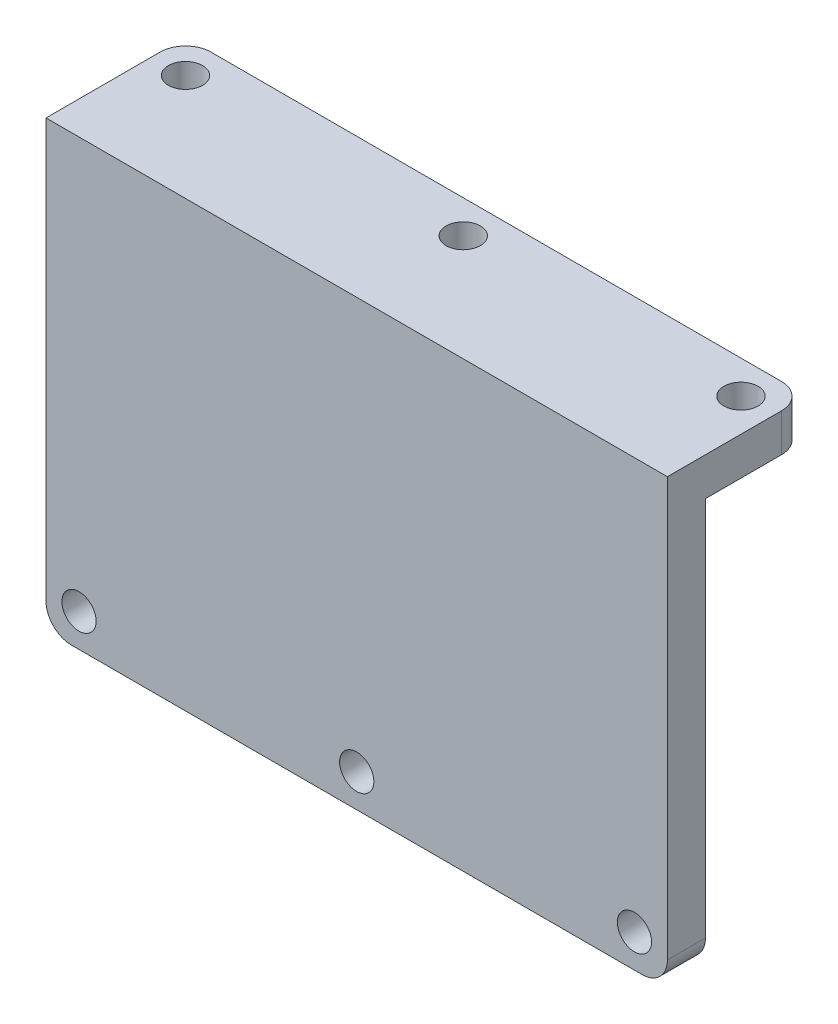
ISO-10303-21;
HEADER;
FILE_DESCRIPTION(('STEP AP214'),'2;1');
FILE_NAME('part.step','',(''),(''),'','','');
FILE_SCHEMA(('AUTOMOTIVE_DESIGN { 1 0 10303 214 1 1 1 1 }'));
ENDSEC;
DATA;
#1=APPLICATION_CONTEXT('core data for automotive mechanical design processes');
#2=APPLICATION_PROTOCOL_DEFINITION('international standard','automotive_design',2000,#1);
#3=PRODUCT_CONTEXT('',#1,'mechanical');
#4=PRODUCT('Part','Part','',(#3));
#5=PRODUCT_RELATED_PRODUCT_CATEGORY('part','',(#4));
#6=PRODUCT_DEFINITION_FORMATION('','',#4);
#7=PRODUCT_DEFINITION_CONTEXT('part definition',#1,'design');
#8=PRODUCT_DEFINITION('design','',#6,#7);
#9=PRODUCT_DEFINITION_SHAPE('','',#8);
#10=(LENGTH_UNIT() NAMED_UNIT(*) SI_UNIT(.MILLI.,.METRE.));
#11=(NAMED_UNIT(*) PLANE_ANGLE_UNIT() SI_UNIT($,.RADIAN.));
#12=(NAMED_UNIT(*) SI_UNIT($,.STERADIAN.) SOLID_ANGLE_UNIT());
#13=UNCERTAINTY_MEASURE_WITH_UNIT(LENGTH_MEASURE(1.E-05),#10,'distance_accuracy_value','');
#14=(GEOMETRIC_REPRESENTATION_CONTEXT(3) GLOBAL_UNCERTAINTY_ASSIGNED_CONTEXT((#13)) GLOBAL_UNIT_ASSIGNED_CONTEXT((#10,
#11,#12)) REPRESENTATION_CONTEXT('',''));
#15=CARTESIAN_POINT('',(0.,0.,0.));
#16=DIRECTION('',(0.,0.,1.));
#17=DIRECTION('',(1.,0.,0.));
#18=AXIS2_PLACEMENT_3D('',#15,#16,#17);
#19=CARTESIAN_POINT('',(0.,0.,0.));
#20=DIRECTION('',(0.,0.,1.));
#21=DIRECTION('',(1.,0.,0.));
#22=AXIS2_PLACEMENT_3D('',#19,#20,#21);
#23=PLANE('',#22);
#24=CARTESIAN_POINT('',(-21.9,-14.9,0.));
#25=DIRECTION('',(0.,0.,-1.));
#26=DIRECTION('',(-1.,0.,0.));
#27=AXIS2_PLACEMENT_3D('',#24,#25,#26);
#28=CIRCLE('',#27,1.35000000000001);
#29=CARTESIAN_POINT('',(-23.25,-14.9,0.));
#30=VERTEX_POINT('',#29);
#31=EDGE_CURVE('E152',#30,#30,#28,.T.);
#32=ORIENTED_EDGE('',*,*,#31,.F.);
#33=EDGE_LOOP('',(#32));
#34=FACE_BOUND('',#33,.T.);
#35=CARTESIAN_POINT('',(0.,-14.9,0.));
#36=DIRECTION('',(0.,0.,-1.));
#37=DIRECTION('',(-1.,0.,0.));
#38=AXIS2_PLACEMENT_3D('',#35,#36,#37);
#39=CIRCLE('',#38,1.35);
#40=CARTESIAN_POINT('',(-1.35,-14.9,0.));
#41=VERTEX_POINT('',#40);
#42=EDGE_CURVE('E165',#41,#41,#39,.T.);
#43=ORIENTED_EDGE('',*,*,#42,.F.);
#44=EDGE_LOOP('',(#43));
#45=FACE_BOUND('',#44,.T.);
#46=CARTESIAN_POINT('',(21.9,-14.9,0.));
#47=DIRECTION('',(0.,0.,-1.));
#48=DIRECTION('',(-1.,0.,0.));
#49=AXIS2_PLACEMENT_3D('',#46,#47,#48);
#50=CIRCLE('',#49,1.35000000000001);
#51=CARTESIAN_POINT('',(20.55,-14.9,0.));
#52=VERTEX_POINT('',#51);
#53=EDGE_CURVE('E157',#52,#52,#50,.T.);
#54=ORIENTED_EDGE('',*,*,#53,.F.);
#55=EDGE_LOOP('',(#54));
#56=FACE_BOUND('',#55,.T.);
#57=DIRECTION('',(0.,1.,0.));
#58=VECTOR('',#57,1.);
#59=CARTESIAN_POINT('',(24.5,17.5,0.));
#60=LINE('',#59,#58);
#61=CARTESIAN_POINT('',(24.5,-15.5,0.));
#62=VERTEX_POINT('',#61);
#63=CARTESIAN_POINT('',(24.5,14.5,0.));
#64=VERTEX_POINT('',#63);
#65=EDGE_CURVE('E133',#62,#64,#60,.T.);
#66=ORIENTED_EDGE('',*,*,#65,.F.);
#67=CARTESIAN_POINT('',(22.5,-15.5,0.));
#68=DIRECTION('',(0.,0.,1.));
#69=DIRECTION('',(1.,0.,0.));
#70=AXIS2_PLACEMENT_3D('',#67,#68,#69);
#71=CIRCLE('',#70,2.);
#72=CARTESIAN_POINT('',(22.5,-17.5,0.));
#73=VERTEX_POINT('',#72);
#74=EDGE_CURVE('E216',#62,#73,#71,.F.);
#75=ORIENTED_EDGE('',*,*,#74,.T.);
#76=DIRECTION('',(1.,0.,0.));
#77=VECTOR('',#76,1.);
#78=CARTESIAN_POINT('',(-24.5,-17.5,0.));
#79=LINE('',#78,#77);
#80=CARTESIAN_POINT('',(-22.5,-17.5,0.));
#81=VERTEX_POINT('',#80);
#82=EDGE_CURVE('E132',#81,#73,#79,.T.);
#83=ORIENTED_EDGE('',*,*,#82,.F.);
#84=CARTESIAN_POINT('',(-22.5,-15.5,0.));
#85=DIRECTION('',(0.,0.,1.));
#86=DIRECTION('',(1.,0.,0.));
#87=AXIS2_PLACEMENT_3D('',#84,#85,#86);
#88=CIRCLE('',#87,2.);
#89=CARTESIAN_POINT('',(-24.5,-15.5,0.));
#90=VERTEX_POINT('',#89);
#91=EDGE_CURVE('E130',#81,#90,#88,.F.);
#92=ORIENTED_EDGE('',*,*,#91,.T.);
#93=DIRECTION('',(0.,-1.,0.));
#94=VECTOR('',#93,1.);
#95=CARTESIAN_POINT('',(-24.5,17.5,0.));
#96=LINE('',#95,#94);
#97=CARTESIAN_POINT('',(-24.5,14.5,0.));
#98=VERTEX_POINT('',#97);
#99=EDGE_CURVE('E117',#98,#90,#96,.T.);
#100=ORIENTED_EDGE('',*,*,#99,.F.);
#101=DIRECTION('',(-1.,0.,0.));
#102=VECTOR('',#101,1.);
#103=CARTESIAN_POINT('',(24.5,14.5,0.));
#104=LINE('',#103,#102);
#105=EDGE_CURVE('E128',#64,#98,#104,.T.);
#106=ORIENTED_EDGE('',*,*,#105,.F.);
#107=EDGE_LOOP('',(#66,#75,#83,#92,#100,#106));
#108=FACE_BOUND('',#107,.T.);
#109=ADVANCED_FACE('F38',(#34,#45,#56,#108),#23,.F.);
#110=CARTESIAN_POINT('',(24.5,17.5,3.));
#111=DIRECTION('',(-1.,0.,0.));
#112=DIRECTION('',(0.,0.,1.));
#113=AXIS2_PLACEMENT_3D('',#110,#111,#112);
#114=PLANE('',#113);
#115=DIRECTION('',(0.,0.,1.));
#116=VECTOR('',#115,1.);
#117=CARTESIAN_POINT('',(24.5,14.5,-8.));
#118=LINE('',#117,#116);
#119=CARTESIAN_POINT('',(24.5,14.5,-6.));
#120=VERTEX_POINT('',#119);
#121=EDGE_CURVE('E122',#120,#64,#118,.T.);
#122=ORIENTED_EDGE('',*,*,#121,.F.);
#123=DIRECTION('',(0.,-1.,0.));
#124=VECTOR('',#123,1.);
#125=CARTESIAN_POINT('',(24.5,17.5,-6.));
#126=LINE('',#125,#124);
#127=CARTESIAN_POINT('',(24.5,17.5,-6.));
#128=VERTEX_POINT('',#127);
#129=EDGE_CURVE('E11',#120,#128,#126,.F.);
#130=ORIENTED_EDGE('',*,*,#129,.T.);
#131=DIRECTION('',(0.,0.,-1.));
#132=VECTOR('',#131,1.);
#133=CARTESIAN_POINT('',(24.5,17.5,3.));
#134=LINE('',#133,#132);
#135=CARTESIAN_POINT('',(24.5,17.5,3.));
#136=VERTEX_POINT('',#135);
#137=EDGE_CURVE('E198',#136,#128,#134,.T.);
#138=ORIENTED_EDGE('',*,*,#137,.F.);
#139=DIRECTION('',(0.,1.,0.));
#140=VECTOR('',#139,1.);
#141=CARTESIAN_POINT('',(24.5,17.5,3.));
#142=LINE('',#141,#140);
#143=CARTESIAN_POINT('',(24.5,-15.5,3.));
#144=VERTEX_POINT('',#143);
#145=EDGE_CURVE('E176',#144,#136,#142,.T.);
#146=ORIENTED_EDGE('',*,*,#145,.F.);
#147=DIRECTION('',(0.,0.,-1.));
#148=VECTOR('',#147,1.);
#149=CARTESIAN_POINT('',(24.5,-15.5,3.));
#150=LINE('',#149,#148);
#151=EDGE_CURVE('E202',#144,#62,#150,.T.);
#152=ORIENTED_EDGE('',*,*,#151,.T.);
#153=ORIENTED_EDGE('',*,*,#65,.T.);
#154=EDGE_LOOP('',(#122,#130,#138,#146,#152,#153));
#155=FACE_BOUND('',#154,.T.);
#156=ADVANCED_FACE('F282',(#155),#114,.F.);
#157=CARTESIAN_POINT('',(-24.5,17.5,3.));
#158=DIRECTION('',(0.,-1.,0.));
#159=DIRECTION('',(0.,0.,-1.));
#160=AXIS2_PLACEMENT_3D('',#157,#158,#159);
#161=PLANE('',#160);
#162=CARTESIAN_POINT('',(-21.9,17.5,-5.4));
#163=DIRECTION('',(0.,1.,0.));
#164=DIRECTION('',(0.,0.,1.));
#165=AXIS2_PLACEMENT_3D('',#162,#163,#164);
#166=CIRCLE('',#165,1.35000000000001);
#167=CARTESIAN_POINT('',(-21.9,17.5,-4.05));
#168=VERTEX_POINT('',#167);
#169=EDGE_CURVE('E207',#168,#168,#166,.T.);
#170=ORIENTED_EDGE('',*,*,#169,.F.);
#171=EDGE_LOOP('',(#170));
#172=FACE_BOUND('',#171,.T.);
#173=CARTESIAN_POINT('',(0.,17.5,-5.4));
#174=DIRECTION('',(0.,1.,0.));
#175=DIRECTION('',(0.,0.,1.));
#176=AXIS2_PLACEMENT_3D('',#173,#174,#175);
#177=CIRCLE('',#176,1.35);
#178=CARTESIAN_POINT('',(0.,17.5,-4.05));
#179=VERTEX_POINT('',#178);
#180=EDGE_CURVE('E478',#179,#179,#177,.T.);
#181=ORIENTED_EDGE('',*,*,#180,.F.);
#182=EDGE_LOOP('',(#181));
#183=FACE_BOUND('',#182,.T.);
#184=CARTESIAN_POINT('',(21.9,17.5,-5.4));
#185=DIRECTION('',(0.,1.,0.));
#186=DIRECTION('',(0.,0.,1.));
#187=AXIS2_PLACEMENT_3D('',#184,#185,#186);
#188=CIRCLE('',#187,1.35);
#189=CARTESIAN_POINT('',(21.9,17.5,-4.05));
#190=VERTEX_POINT('',#189);
#191=EDGE_CURVE('E482',#190,#190,#188,.T.);
#192=ORIENTED_EDGE('',*,*,#191,.F.);
#193=EDGE_LOOP('',(#192));
#194=FACE_BOUND('',#193,.T.);
#195=DIRECTION('',(1.,0.,0.));
#196=VECTOR('',#195,1.);
#197=CARTESIAN_POINT('',(24.5,17.5,-8.));
#198=LINE('',#197,#196);
#199=CARTESIAN_POINT('',(-22.5,17.5,-8.));
#200=VERTEX_POINT('',#199);
#201=CARTESIAN_POINT('',(22.5,17.5,-8.));
#202=VERTEX_POINT('',#201);
#203=EDGE_CURVE('E123',#200,#202,#198,.T.);
#204=ORIENTED_EDGE('',*,*,#203,.F.);
#205=CARTESIAN_POINT('',(-22.5,17.5,-6.));
#206=DIRECTION('',(0.,-1.,0.));
#207=DIRECTION('',(0.,0.,-1.));
#208=AXIS2_PLACEMENT_3D('',#205,#206,#207);
#209=CIRCLE('',#208,2.);
#210=CARTESIAN_POINT('',(-24.5,17.5,-6.));
#211=VERTEX_POINT('',#210);
#212=EDGE_CURVE('E246',#200,#211,#209,.F.);
#213=ORIENTED_EDGE('',*,*,#212,.T.);
#214=DIRECTION('',(0.,0.,-1.));
#215=VECTOR('',#214,1.);
#216=CARTESIAN_POINT('',(-24.5,17.5,3.));
#217=LINE('',#216,#215);
#218=CARTESIAN_POINT('',(-24.5,17.5,3.));
#219=VERTEX_POINT('',#218);
#220=EDGE_CURVE('E190',#219,#211,#217,.T.);
#221=ORIENTED_EDGE('',*,*,#220,.F.);
#222=DIRECTION('',(-1.,0.,0.));
#223=VECTOR('',#222,1.);
#224=CARTESIAN_POINT('',(-24.5,17.5,3.));
#225=LINE('',#224,#223);
#226=EDGE_CURVE('E179',#136,#219,#225,.T.);
#227=ORIENTED_EDGE('',*,*,#226,.F.);
#228=ORIENTED_EDGE('',*,*,#137,.T.);
#229=CARTESIAN_POINT('',(22.5,17.5,-6.));
#230=DIRECTION('',(0.,-1.,0.));
#231=DIRECTION('',(0.,0.,-1.));
#232=AXIS2_PLACEMENT_3D('',#229,#230,#231);
#233=CIRCLE('',#232,2.);
#234=EDGE_CURVE('E243',#128,#202,#233,.F.);
#235=ORIENTED_EDGE('',*,*,#234,.T.);
#236=EDGE_LOOP('',(#204,#213,#221,#227,#228,#235));
#237=FACE_BOUND('',#236,.T.);
#238=ADVANCED_FACE('F263',(#172,#183,#194,#237),#161,.F.);
#239=CARTESIAN_POINT('',(-24.5,17.5,3.));
#240=DIRECTION('',(1.,0.,0.));
#241=DIRECTION('',(0.,0.,-1.));
#242=AXIS2_PLACEMENT_3D('',#239,#240,#241);
#243=PLANE('',#242);
#244=ORIENTED_EDGE('',*,*,#220,.T.);
#245=DIRECTION('',(0.,1.,0.));
#246=VECTOR('',#245,1.);
#247=CARTESIAN_POINT('',(-24.5,14.5,-6.));
#248=LINE('',#247,#246);
#249=CARTESIAN_POINT('',(-24.5,14.5,-6.));
#250=VERTEX_POINT('',#249);
#251=EDGE_CURVE('E62',#211,#250,#248,.F.);
#252=ORIENTED_EDGE('',*,*,#251,.T.);
#253=DIRECTION('',(0.,0.,1.));
#254=VECTOR('',#253,1.);
#255=CARTESIAN_POINT('',(-24.5,14.5,-8.));
#256=LINE('',#255,#254);
#257=EDGE_CURVE('E114',#250,#98,#256,.T.);
#258=ORIENTED_EDGE('',*,*,#257,.T.);
#259=ORIENTED_EDGE('',*,*,#99,.T.);
#260=DIRECTION('',(0.,0.,-1.));
#261=VECTOR('',#260,1.);
#262=CARTESIAN_POINT('',(-24.5,-15.5,3.));
#263=LINE('',#262,#261);
#264=CARTESIAN_POINT('',(-24.5,-15.5,3.));
#265=VERTEX_POINT('',#264);
#266=EDGE_CURVE('E232',#90,#265,#263,.F.);
#267=ORIENTED_EDGE('',*,*,#266,.T.);
#268=DIRECTION('',(0.,-1.,0.));
#269=VECTOR('',#268,1.);
#270=CARTESIAN_POINT('',(-24.5,17.5,3.));
#271=LINE('',#270,#269);
#272=EDGE_CURVE('E182',#219,#265,#271,.T.);
#273=ORIENTED_EDGE('',*,*,#272,.F.);
#274=EDGE_LOOP('',(#244,#252,#258,#259,#267,#273));
#275=FACE_BOUND('',#274,.T.);
#276=ADVANCED_FACE('F116',(#275),#243,.F.);
#277=CARTESIAN_POINT('',(-24.5,-17.5,3.));
#278=DIRECTION('',(0.,1.,0.));
#279=DIRECTION('',(0.,0.,1.));
#280=AXIS2_PLACEMENT_3D('',#277,#278,#279);
#281=PLANE('',#280);
#282=ORIENTED_EDGE('',*,*,#82,.T.);
#283=DIRECTION('',(0.,0.,-1.));
#284=VECTOR('',#283,1.);
#285=CARTESIAN_POINT('',(22.5,-17.5,3.));
#286=LINE('',#285,#284);
#287=CARTESIAN_POINT('',(22.5,-17.5,3.));
#288=VERTEX_POINT('',#287);
#289=EDGE_CURVE('E223',#73,#288,#286,.F.);
#290=ORIENTED_EDGE('',*,*,#289,.T.);
#291=DIRECTION('',(1.,0.,0.));
#292=VECTOR('',#291,1.);
#293=CARTESIAN_POINT('',(-24.5,-17.5,3.));
#294=LINE('',#293,#292);
#295=CARTESIAN_POINT('',(-22.5,-17.5,3.));
#296=VERTEX_POINT('',#295);
#297=EDGE_CURVE('E186',#296,#288,#294,.T.);
#298=ORIENTED_EDGE('',*,*,#297,.F.);
#299=DIRECTION('',(0.,0.,-1.));
#300=VECTOR('',#299,1.);
#301=CARTESIAN_POINT('',(-22.5,-17.5,3.));
#302=LINE('',#301,#300);
#303=EDGE_CURVE('E219',#296,#81,#302,.T.);
#304=ORIENTED_EDGE('',*,*,#303,.T.);
#305=EDGE_LOOP('',(#282,#290,#298,#304));
#306=FACE_BOUND('',#305,.T.);
#307=ADVANCED_FACE('F274',(#306),#281,.F.);
#308=CARTESIAN_POINT('',(0.,0.,3.));
#309=DIRECTION('',(0.,0.,1.));
#310=DIRECTION('',(1.,0.,0.));
#311=AXIS2_PLACEMENT_3D('',#308,#309,#310);
#312=PLANE('',#311);
#313=CARTESIAN_POINT('',(21.9,-14.9,3.));
#314=DIRECTION('',(0.,0.,-1.));
#315=DIRECTION('',(-1.,0.,0.));
#316=AXIS2_PLACEMENT_3D('',#313,#314,#315);
#317=CIRCLE('',#316,1.35000000000001);
#318=CARTESIAN_POINT('',(20.55,-14.9,3.));
#319=VERTEX_POINT('',#318);
#320=EDGE_CURVE('E153',#319,#319,#317,.T.);
#321=ORIENTED_EDGE('',*,*,#320,.T.);
#322=EDGE_LOOP('',(#321));
#323=FACE_BOUND('',#322,.T.);
#324=CARTESIAN_POINT('',(0.,-14.9,3.));
#325=DIRECTION('',(0.,0.,-1.));
#326=DIRECTION('',(-1.,0.,0.));
#327=AXIS2_PLACEMENT_3D('',#324,#325,#326);
#328=CIRCLE('',#327,1.35);
#329=CARTESIAN_POINT('',(-1.35,-14.9,3.));
#330=VERTEX_POINT('',#329);
#331=EDGE_CURVE('E161',#330,#330,#328,.T.);
#332=ORIENTED_EDGE('',*,*,#331,.T.);
#333=EDGE_LOOP('',(#332));
#334=FACE_BOUND('',#333,.T.);
#335=CARTESIAN_POINT('',(-21.9,-14.9,3.));
#336=DIRECTION('',(0.,0.,-1.));
#337=DIRECTION('',(-1.,0.,0.));
#338=AXIS2_PLACEMENT_3D('',#335,#336,#337);
#339=CIRCLE('',#338,1.35000000000001);
#340=CARTESIAN_POINT('',(-23.25,-14.9,3.));
#341=VERTEX_POINT('',#340);
#342=EDGE_CURVE('E169',#341,#341,#339,.T.);
#343=ORIENTED_EDGE('',*,*,#342,.T.);
#344=EDGE_LOOP('',(#343));
#345=FACE_BOUND('',#344,.T.);
#346=ORIENTED_EDGE('',*,*,#297,.T.);
#347=CARTESIAN_POINT('',(22.5,-15.5,3.));
#348=DIRECTION('',(0.,0.,1.));
#349=DIRECTION('',(1.,0.,0.));
#350=AXIS2_PLACEMENT_3D('',#347,#348,#349);
#351=CIRCLE('',#350,2.);
#352=EDGE_CURVE('E229',#288,#144,#351,.T.);
#353=ORIENTED_EDGE('',*,*,#352,.T.);
#354=ORIENTED_EDGE('',*,*,#145,.T.);
#355=ORIENTED_EDGE('',*,*,#226,.T.);
#356=ORIENTED_EDGE('',*,*,#272,.T.);
#357=CARTESIAN_POINT('',(-22.5,-15.5,3.));
#358=DIRECTION('',(0.,0.,1.));
#359=DIRECTION('',(1.,0.,0.));
#360=AXIS2_PLACEMENT_3D('',#357,#358,#359);
#361=CIRCLE('',#360,2.);
#362=EDGE_CURVE('E226',#265,#296,#361,.T.);
#363=ORIENTED_EDGE('',*,*,#362,.T.);
#364=EDGE_LOOP('',(#346,#353,#354,#355,#356,#363));
#365=FACE_BOUND('',#364,.T.);
#366=ADVANCED_FACE('F268',(#323,#334,#345,#365),#312,.T.);
#367=CARTESIAN_POINT('',(-21.9,-14.9,3.));
#368=DIRECTION('',(0.,0.,-1.));
#369=DIRECTION('',(-1.,0.,0.));
#370=AXIS2_PLACEMENT_3D('',#367,#368,#369);
#371=CYLINDRICAL_SURFACE('',#370,1.35000000000001);
#372=ORIENTED_EDGE('',*,*,#342,.F.);
#373=EDGE_LOOP('',(#372));
#374=FACE_BOUND('',#373,.T.);
#375=ORIENTED_EDGE('',*,*,#31,.T.);
#376=EDGE_LOOP('',(#375));
#377=FACE_BOUND('',#376,.T.);
#378=ADVANCED_FACE('F375',(#374,#377),#371,.F.);
#379=CARTESIAN_POINT('',(0.,-14.9,3.));
#380=DIRECTION('',(0.,0.,-1.));
#381=DIRECTION('',(-1.,0.,0.));
#382=AXIS2_PLACEMENT_3D('',#379,#380,#381);
#383=CYLINDRICAL_SURFACE('',#382,1.35);
#384=ORIENTED_EDGE('',*,*,#331,.F.);
#385=EDGE_LOOP('',(#384));
#386=FACE_BOUND('',#385,.T.);
#387=ORIENTED_EDGE('',*,*,#42,.T.);
#388=EDGE_LOOP('',(#387));
#389=FACE_BOUND('',#388,.T.);
#390=ADVANCED_FACE('F438',(#386,#389),#383,.F.);
#391=CARTESIAN_POINT('',(21.9,-14.9,3.));
#392=DIRECTION('',(0.,0.,-1.));
#393=DIRECTION('',(-1.,0.,0.));
#394=AXIS2_PLACEMENT_3D('',#391,#392,#393);
#395=CYLINDRICAL_SURFACE('',#394,1.35000000000001);
#396=ORIENTED_EDGE('',*,*,#320,.F.);
#397=EDGE_LOOP('',(#396));
#398=FACE_BOUND('',#397,.T.);
#399=ORIENTED_EDGE('',*,*,#53,.T.);
#400=EDGE_LOOP('',(#399));
#401=FACE_BOUND('',#400,.T.);
#402=ADVANCED_FACE('F343',(#398,#401),#395,.F.);
#403=CARTESIAN_POINT('',(24.5,14.5,-8.));
#404=DIRECTION('',(0.,1.,0.));
#405=DIRECTION('',(0.,0.,1.));
#406=AXIS2_PLACEMENT_3D('',#403,#404,#405);
#407=PLANE('',#406);
#408=CARTESIAN_POINT('',(-21.9,14.5,-5.4));
#409=DIRECTION('',(0.,1.,0.));
#410=DIRECTION('',(0.,0.,1.));
#411=AXIS2_PLACEMENT_3D('',#408,#409,#410);
#412=CIRCLE('',#411,1.35000000000001);
#413=CARTESIAN_POINT('',(-21.9,14.5,-4.05));
#414=VERTEX_POINT('',#413);
#415=EDGE_CURVE('E139',#414,#414,#412,.T.);
#416=ORIENTED_EDGE('',*,*,#415,.T.);
#417=EDGE_LOOP('',(#416));
#418=FACE_BOUND('',#417,.T.);
#419=CARTESIAN_POINT('',(0.,14.5,-5.4));
#420=DIRECTION('',(0.,1.,0.));
#421=DIRECTION('',(0.,0.,1.));
#422=AXIS2_PLACEMENT_3D('',#419,#420,#421);
#423=CIRCLE('',#422,1.35);
#424=CARTESIAN_POINT('',(0.,14.5,-4.05));
#425=VERTEX_POINT('',#424);
#426=EDGE_CURVE('E146',#425,#425,#423,.T.);
#427=ORIENTED_EDGE('',*,*,#426,.T.);
#428=EDGE_LOOP('',(#427));
#429=FACE_BOUND('',#428,.T.);
#430=CARTESIAN_POINT('',(21.9,14.5,-5.4));
#431=DIRECTION('',(0.,1.,0.));
#432=DIRECTION('',(0.,0.,1.));
#433=AXIS2_PLACEMENT_3D('',#430,#431,#432);
#434=CIRCLE('',#433,1.35);
#435=CARTESIAN_POINT('',(21.9,14.5,-4.05));
#436=VERTEX_POINT('',#435);
#437=EDGE_CURVE('E203',#436,#436,#434,.T.);
#438=ORIENTED_EDGE('',*,*,#437,.T.);
#439=EDGE_LOOP('',(#438));
#440=FACE_BOUND('',#439,.T.);
#441=ORIENTED_EDGE('',*,*,#257,.F.);
#442=CARTESIAN_POINT('',(-22.5,14.5,-6.));
#443=DIRECTION('',(0.,1.,0.));
#444=DIRECTION('',(0.,0.,1.));
#445=AXIS2_PLACEMENT_3D('',#442,#443,#444);
#446=CIRCLE('',#445,2.);
#447=CARTESIAN_POINT('',(-22.5,14.5,-8.));
#448=VERTEX_POINT('',#447);
#449=EDGE_CURVE('E47',#250,#448,#446,.F.);
#450=ORIENTED_EDGE('',*,*,#449,.T.);
#451=DIRECTION('',(-1.,0.,0.));
#452=VECTOR('',#451,1.);
#453=CARTESIAN_POINT('',(24.5,14.5,-8.));
#454=LINE('',#453,#452);
#455=CARTESIAN_POINT('',(22.5,14.5,-8.));
#456=VERTEX_POINT('',#455);
#457=EDGE_CURVE('E138',#456,#448,#454,.T.);
#458=ORIENTED_EDGE('',*,*,#457,.F.);
#459=CARTESIAN_POINT('',(22.5,14.5,-6.));
#460=DIRECTION('',(0.,1.,0.));
#461=DIRECTION('',(0.,0.,1.));
#462=AXIS2_PLACEMENT_3D('',#459,#460,#461);
#463=CIRCLE('',#462,2.);
#464=EDGE_CURVE('E54',#456,#120,#463,.F.);
#465=ORIENTED_EDGE('',*,*,#464,.T.);
#466=ORIENTED_EDGE('',*,*,#121,.T.);
#467=ORIENTED_EDGE('',*,*,#105,.T.);
#468=EDGE_LOOP('',(#441,#450,#458,#465,#466,#467));
#469=FACE_BOUND('',#468,.T.);
#470=ADVANCED_FACE('F135',(#418,#429,#440,#469),#407,.F.);
#471=CARTESIAN_POINT('',(0.,0.,-8.));
#472=DIRECTION('',(0.,0.,-1.));
#473=DIRECTION('',(-1.,0.,0.));
#474=AXIS2_PLACEMENT_3D('',#471,#472,#473);
#475=PLANE('',#474);
#476=ORIENTED_EDGE('',*,*,#457,.T.);
#477=DIRECTION('',(0.,1.,0.));
#478=VECTOR('',#477,1.);
#479=CARTESIAN_POINT('',(-22.5,17.5,-8.));
#480=LINE('',#479,#478);
#481=EDGE_CURVE('E239',#448,#200,#480,.T.);
#482=ORIENTED_EDGE('',*,*,#481,.T.);
#483=ORIENTED_EDGE('',*,*,#203,.T.);
#484=DIRECTION('',(0.,-1.,0.));
#485=VECTOR('',#484,1.);
#486=CARTESIAN_POINT('',(22.5,14.5,-8.));
#487=LINE('',#486,#485);
#488=EDGE_CURVE('E235',#202,#456,#487,.T.);
#489=ORIENTED_EDGE('',*,*,#488,.T.);
#490=EDGE_LOOP('',(#476,#482,#483,#489));
#491=FACE_BOUND('',#490,.T.);
#492=ADVANCED_FACE('F256',(#491),#475,.T.);
#493=CARTESIAN_POINT('',(21.9,-17.5,-5.4));
#494=DIRECTION('',(0.,1.,0.));
#495=DIRECTION('',(0.,0.,1.));
#496=AXIS2_PLACEMENT_3D('',#493,#494,#495);
#497=CYLINDRICAL_SURFACE('',#496,1.35);
#498=ORIENTED_EDGE('',*,*,#191,.T.);
#499=EDGE_LOOP('',(#498));
#500=FACE_BOUND('',#499,.T.);
#501=ORIENTED_EDGE('',*,*,#437,.F.);
#502=EDGE_LOOP('',(#501));
#503=FACE_BOUND('',#502,.T.);
#504=ADVANCED_FACE('F336',(#500,#503),#497,.F.);
#505=CARTESIAN_POINT('',(0.,-17.5,-5.4));
#506=DIRECTION('',(0.,1.,0.));
#507=DIRECTION('',(0.,0.,1.));
#508=AXIS2_PLACEMENT_3D('',#505,#506,#507);
#509=CYLINDRICAL_SURFACE('',#508,1.35);
#510=ORIENTED_EDGE('',*,*,#180,.T.);
#511=EDGE_LOOP('',(#510));
#512=FACE_BOUND('',#511,.T.);
#513=ORIENTED_EDGE('',*,*,#426,.F.);
#514=EDGE_LOOP('',(#513));
#515=FACE_BOUND('',#514,.T.);
#516=ADVANCED_FACE('F407',(#512,#515),#509,.F.);
#517=CARTESIAN_POINT('',(-21.9,-17.5,-5.4));
#518=DIRECTION('',(0.,1.,0.));
#519=DIRECTION('',(0.,0.,1.));
#520=AXIS2_PLACEMENT_3D('',#517,#518,#519);
#521=CYLINDRICAL_SURFACE('',#520,1.35000000000001);
#522=ORIENTED_EDGE('',*,*,#169,.T.);
#523=EDGE_LOOP('',(#522));
#524=FACE_BOUND('',#523,.T.);
#525=ORIENTED_EDGE('',*,*,#415,.F.);
#526=EDGE_LOOP('',(#525));
#527=FACE_BOUND('',#526,.T.);
#528=ADVANCED_FACE('F313',(#524,#527),#521,.F.);
#529=CARTESIAN_POINT('',(22.5,-15.5,3.));
#530=DIRECTION('',(0.,0.,-1.));
#531=DIRECTION('',(-1.,0.,0.));
#532=AXIS2_PLACEMENT_3D('',#529,#530,#531);
#533=CYLINDRICAL_SURFACE('',#532,2.);
#534=ORIENTED_EDGE('',*,*,#352,.F.);
#535=ORIENTED_EDGE('',*,*,#289,.F.);
#536=ORIENTED_EDGE('',*,*,#74,.F.);
#537=ORIENTED_EDGE('',*,*,#151,.F.);
#538=EDGE_LOOP('',(#534,#535,#536,#537));
#539=FACE_BOUND('',#538,.T.);
#540=ADVANCED_FACE('F279',(#539),#533,.T.);
#541=CARTESIAN_POINT('',(-22.5,-15.5,3.));
#542=DIRECTION('',(0.,0.,-1.));
#543=DIRECTION('',(-1.,0.,0.));
#544=AXIS2_PLACEMENT_3D('',#541,#542,#543);
#545=CYLINDRICAL_SURFACE('',#544,2.);
#546=ORIENTED_EDGE('',*,*,#362,.F.);
#547=ORIENTED_EDGE('',*,*,#266,.F.);
#548=ORIENTED_EDGE('',*,*,#91,.F.);
#549=ORIENTED_EDGE('',*,*,#303,.F.);
#550=EDGE_LOOP('',(#546,#547,#548,#549));
#551=FACE_BOUND('',#550,.T.);
#552=ADVANCED_FACE('F272',(#551),#545,.T.);
#553=CARTESIAN_POINT('',(-22.5,0.,-6.));
#554=DIRECTION('',(0.,-1.,0.));
#555=DIRECTION('',(0.,0.,-1.));
#556=AXIS2_PLACEMENT_3D('',#553,#554,#555);
#557=CYLINDRICAL_SURFACE('',#556,2.);
#558=ORIENTED_EDGE('',*,*,#449,.F.);
#559=ORIENTED_EDGE('',*,*,#251,.F.);
#560=ORIENTED_EDGE('',*,*,#212,.F.);
#561=ORIENTED_EDGE('',*,*,#481,.F.);
#562=EDGE_LOOP('',(#558,#559,#560,#561));
#563=FACE_BOUND('',#562,.T.);
#564=ADVANCED_FACE('F260',(#563),#557,.T.);
#565=CARTESIAN_POINT('',(22.5,0.,-6.));
#566=DIRECTION('',(0.,1.,0.));
#567=DIRECTION('',(0.,0.,1.));
#568=AXIS2_PLACEMENT_3D('',#565,#566,#567);
#569=CYLINDRICAL_SURFACE('',#568,2.);
#570=ORIENTED_EDGE('',*,*,#234,.F.);
#571=ORIENTED_EDGE('',*,*,#129,.F.);
#572=ORIENTED_EDGE('',*,*,#464,.F.);
#573=ORIENTED_EDGE('',*,*,#488,.F.);
#574=EDGE_LOOP('',(#570,#571,#572,#573));
#575=FACE_BOUND('',#574,.T.);
#576=ADVANCED_FACE('F40',(#575),#569,.T.);
#577=CLOSED_SHELL('',(#109,#156,#238,#276,#307,#366,#378,#390,#402,#470,#492,#504,#516,#528,
#540,#552,#564,#576));
#578=MANIFOLD_SOLID_BREP('B2',#577);
#579=ADVANCED_BREP_SHAPE_REPRESENTATION('',(#18,#578),#14);
#580=SHAPE_DEFINITION_REPRESENTATION(#9,#579);
ENDSEC;
END-ISO-10303-21;
